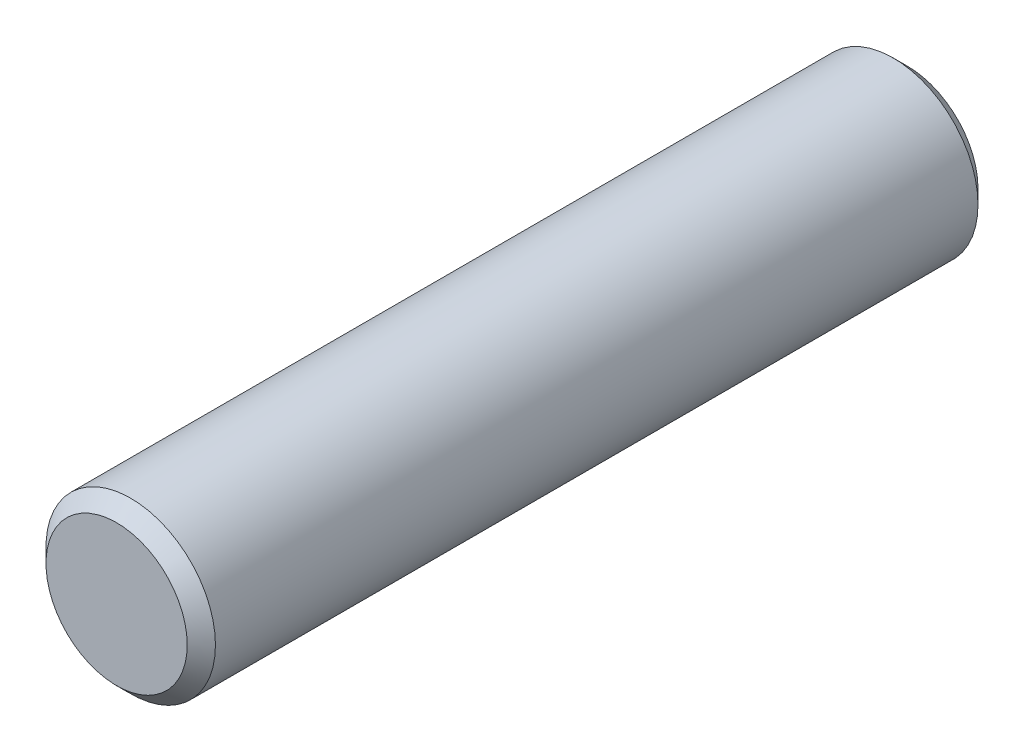
ISO-10303-21;
HEADER;
FILE_DESCRIPTION(('STEP AP214'),'2;1');
FILE_NAME('part.step','',(''),(''),'','','');
FILE_SCHEMA(('AUTOMOTIVE_DESIGN { 1 0 10303 214 1 1 1 1 }'));
ENDSEC;
DATA;
#1=APPLICATION_CONTEXT('core data for automotive mechanical design processes');
#2=APPLICATION_PROTOCOL_DEFINITION('international standard','automotive_design',2000,#1);
#3=PRODUCT_CONTEXT('',#1,'mechanical');
#4=PRODUCT('Part','Part','',(#3));
#5=PRODUCT_RELATED_PRODUCT_CATEGORY('part','',(#4));
#6=PRODUCT_DEFINITION_FORMATION('','',#4);
#7=PRODUCT_DEFINITION_CONTEXT('part definition',#1,'design');
#8=PRODUCT_DEFINITION('design','',#6,#7);
#9=PRODUCT_DEFINITION_SHAPE('','',#8);
#10=(LENGTH_UNIT() NAMED_UNIT(*) SI_UNIT(.MILLI.,.METRE.));
#11=(NAMED_UNIT(*) PLANE_ANGLE_UNIT() SI_UNIT($,.RADIAN.));
#12=(NAMED_UNIT(*) SI_UNIT($,.STERADIAN.) SOLID_ANGLE_UNIT());
#13=UNCERTAINTY_MEASURE_WITH_UNIT(LENGTH_MEASURE(1.E-05),#10,'distance_accuracy_value','');
#14=(GEOMETRIC_REPRESENTATION_CONTEXT(3) GLOBAL_UNCERTAINTY_ASSIGNED_CONTEXT((#13)) GLOBAL_UNIT_ASSIGNED_CONTEXT((#10,
#11,#12)) REPRESENTATION_CONTEXT('',''));
#15=CARTESIAN_POINT('',(0.,0.,0.));
#16=DIRECTION('',(0.,0.,1.));
#17=DIRECTION('',(1.,0.,0.));
#18=AXIS2_PLACEMENT_3D('',#15,#16,#17);
#19=CARTESIAN_POINT('',(0.,0.,88.9));
#20=DIRECTION('',(0.,0.,-1.));
#21=DIRECTION('',(-1.,0.,0.));
#22=AXIS2_PLACEMENT_3D('',#19,#20,#21);
#23=CYLINDRICAL_SURFACE('',#22,19.05);
#24=CARTESIAN_POINT('',(0.,0.,-85.725));
#25=DIRECTION('',(0.,0.,1.));
#26=DIRECTION('',(1.,0.,0.));
#27=AXIS2_PLACEMENT_3D('',#24,#25,#26);
#28=CIRCLE('',#27,19.05);
#29=CARTESIAN_POINT('',(19.05,0.,-85.725));
#30=VERTEX_POINT('',#29);
#31=EDGE_CURVE('E57',#30,#30,#28,.T.);
#32=ORIENTED_EDGE('',*,*,#31,.T.);
#33=EDGE_LOOP('',(#32));
#34=FACE_BOUND('',#33,.T.);
#35=CARTESIAN_POINT('',(0.,0.,85.725));
#36=DIRECTION('',(0.,0.,1.));
#37=DIRECTION('',(1.,0.,0.));
#38=AXIS2_PLACEMENT_3D('',#35,#36,#37);
#39=CIRCLE('',#38,19.05);
#40=CARTESIAN_POINT('',(19.05,0.,85.725));
#41=VERTEX_POINT('',#40);
#42=EDGE_CURVE('E62',#41,#41,#39,.F.);
#43=ORIENTED_EDGE('',*,*,#42,.T.);
#44=EDGE_LOOP('',(#43));
#45=FACE_BOUND('',#44,.T.);
#46=ADVANCED_FACE('F43',(#34,#45),#23,.T.);
#47=CARTESIAN_POINT('',(0.,0.,88.9));
#48=DIRECTION('',(0.,0.,1.));
#49=DIRECTION('',(1.,0.,0.));
#50=AXIS2_PLACEMENT_3D('',#47,#48,#49);
#51=PLANE('',#50);
#52=CARTESIAN_POINT('',(0.,0.,88.9));
#53=DIRECTION('',(0.,0.,1.));
#54=DIRECTION('',(1.,0.,0.));
#55=AXIS2_PLACEMENT_3D('',#52,#53,#54);
#56=CIRCLE('',#55,15.875);
#57=CARTESIAN_POINT('',(15.875,0.,88.9));
#58=VERTEX_POINT('',#57);
#59=EDGE_CURVE('E10',#58,#58,#56,.T.);
#60=ORIENTED_EDGE('',*,*,#59,.T.);
#61=EDGE_LOOP('',(#60));
#62=FACE_BOUND('',#61,.T.);
#63=ADVANCED_FACE('F79',(#62),#51,.T.);
#64=CARTESIAN_POINT('',(0.,0.,-88.9));
#65=DIRECTION('',(0.,0.,1.));
#66=DIRECTION('',(1.,0.,0.));
#67=AXIS2_PLACEMENT_3D('',#64,#65,#66);
#68=PLANE('',#67);
#69=CARTESIAN_POINT('',(0.,0.,-88.9));
#70=DIRECTION('',(0.,0.,1.));
#71=DIRECTION('',(1.,0.,0.));
#72=AXIS2_PLACEMENT_3D('',#69,#70,#71);
#73=CIRCLE('',#72,15.875);
#74=CARTESIAN_POINT('',(15.875,0.,-88.9));
#75=VERTEX_POINT('',#74);
#76=EDGE_CURVE('E52',#75,#75,#73,.F.);
#77=ORIENTED_EDGE('',*,*,#76,.T.);
#78=EDGE_LOOP('',(#77));
#79=FACE_BOUND('',#78,.T.);
#80=ADVANCED_FACE('F76',(#79),#68,.F.);
#81=CARTESIAN_POINT('',(0.,0.,-85.725));
#82=DIRECTION('',(0.,0.,1.));
#83=DIRECTION('',(1.,0.,0.));
#84=AXIS2_PLACEMENT_3D('',#81,#82,#83);
#85=CONICAL_SURFACE('',#84,19.05,0.785398163397451);
#86=ORIENTED_EDGE('',*,*,#76,.F.);
#87=EDGE_LOOP('',(#86));
#88=FACE_BOUND('',#87,.T.);
#89=ORIENTED_EDGE('',*,*,#31,.F.);
#90=EDGE_LOOP('',(#89));
#91=FACE_BOUND('',#90,.T.);
#92=ADVANCED_FACE('F72',(#88,#91),#85,.T.);
#93=CARTESIAN_POINT('',(0.,0.,88.9));
#94=DIRECTION('',(0.,0.,-1.));
#95=DIRECTION('',(-1.,0.,0.));
#96=AXIS2_PLACEMENT_3D('',#93,#94,#95);
#97=CONICAL_SURFACE('',#96,15.875,0.785398163397447);
#98=ORIENTED_EDGE('',*,*,#42,.F.);
#99=EDGE_LOOP('',(#98));
#100=FACE_BOUND('',#99,.T.);
#101=ORIENTED_EDGE('',*,*,#59,.F.);
#102=EDGE_LOOP('',(#101));
#103=FACE_BOUND('',#102,.T.);
#104=ADVANCED_FACE('F46',(#100,#103),#97,.T.);
#105=CLOSED_SHELL('',(#46,#63,#80,#92,#104));
#106=MANIFOLD_SOLID_BREP('B2',#105);
#107=ADVANCED_BREP_SHAPE_REPRESENTATION('',(#18,#106),#14);
#108=SHAPE_DEFINITION_REPRESENTATION(#9,#107);
ENDSEC;
END-ISO-10303-21;
